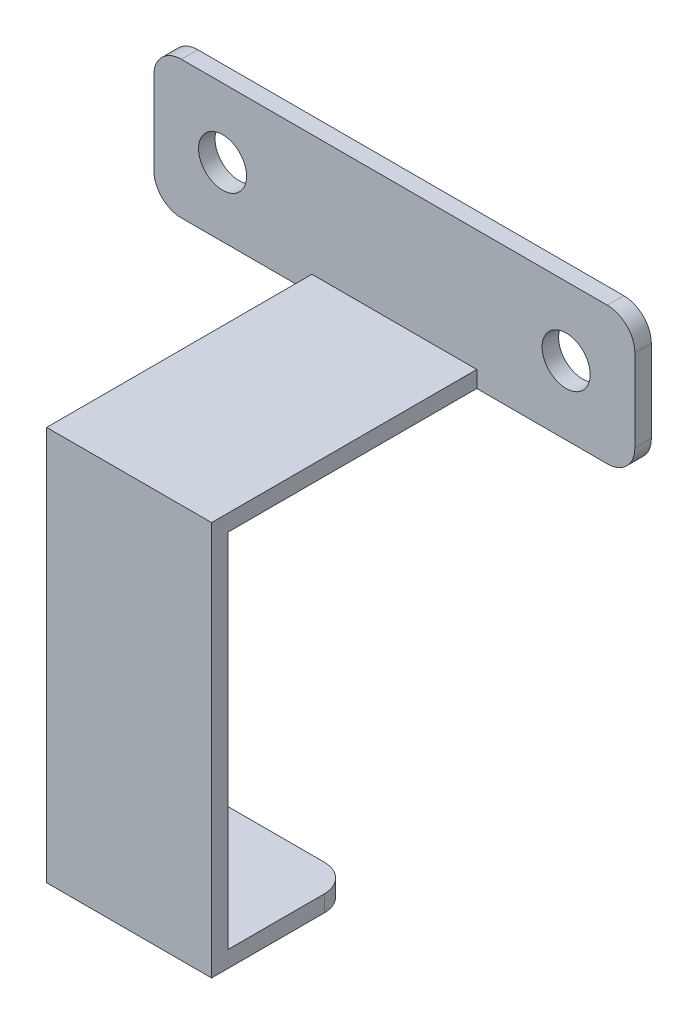
ISO-10303-21;
HEADER;
FILE_DESCRIPTION(('STEP AP214'),'2;1');
FILE_NAME('part.step','',(''),(''),'','','');
FILE_SCHEMA(('AUTOMOTIVE_DESIGN { 1 0 10303 214 1 1 1 1 }'));
ENDSEC;
DATA;
#1=APPLICATION_CONTEXT('core data for automotive mechanical design processes');
#2=APPLICATION_PROTOCOL_DEFINITION('international standard','automotive_design',2000,#1);
#3=PRODUCT_CONTEXT('',#1,'mechanical');
#4=PRODUCT('Part','Part','',(#3));
#5=PRODUCT_RELATED_PRODUCT_CATEGORY('part','',(#4));
#6=PRODUCT_DEFINITION_FORMATION('','',#4);
#7=PRODUCT_DEFINITION_CONTEXT('part definition',#1,'design');
#8=PRODUCT_DEFINITION('design','',#6,#7);
#9=PRODUCT_DEFINITION_SHAPE('','',#8);
#10=(LENGTH_UNIT() NAMED_UNIT(*) SI_UNIT(.MILLI.,.METRE.));
#11=(NAMED_UNIT(*) PLANE_ANGLE_UNIT() SI_UNIT($,.RADIAN.));
#12=(NAMED_UNIT(*) SI_UNIT($,.STERADIAN.) SOLID_ANGLE_UNIT());
#13=UNCERTAINTY_MEASURE_WITH_UNIT(LENGTH_MEASURE(1.E-05),#10,'distance_accuracy_value','');
#14=(GEOMETRIC_REPRESENTATION_CONTEXT(3) GLOBAL_UNCERTAINTY_ASSIGNED_CONTEXT((#13)) GLOBAL_UNIT_ASSIGNED_CONTEXT((#10,
#11,#12)) REPRESENTATION_CONTEXT('',''));
#15=CARTESIAN_POINT('',(0.,0.,0.));
#16=DIRECTION('',(0.,0.,1.));
#17=DIRECTION('',(1.,0.,0.));
#18=AXIS2_PLACEMENT_3D('',#15,#16,#17);
#19=CARTESIAN_POINT('',(-15.5,2.,1.2));
#20=DIRECTION('',(0.,0.,-1.));
#21=DIRECTION('',(-1.,0.,0.));
#22=AXIS2_PLACEMENT_3D('',#19,#20,#21);
#23=CYLINDRICAL_SURFACE('',#22,2.);
#24=CARTESIAN_POINT('',(-15.5,2.,0.));
#25=DIRECTION('',(0.,0.,-1.));
#26=DIRECTION('',(-1.,0.,0.));
#27=AXIS2_PLACEMENT_3D('',#24,#25,#26);
#28=CIRCLE('',#27,2.);
#29=CARTESIAN_POINT('',(-15.5,0.,0.));
#30=VERTEX_POINT('',#29);
#31=CARTESIAN_POINT('',(-17.5,2.,0.));
#32=VERTEX_POINT('',#31);
#33=EDGE_CURVE('E200',#30,#32,#28,.T.);
#34=ORIENTED_EDGE('',*,*,#33,.F.);
#35=DIRECTION('',(0.,0.,1.));
#36=VECTOR('',#35,1.);
#37=CARTESIAN_POINT('',(-15.5,0.,0.6));
#38=LINE('',#37,#36);
#39=CARTESIAN_POINT('',(-15.5,0.,1.2));
#40=VERTEX_POINT('',#39);
#41=EDGE_CURVE('E208',#30,#40,#38,.T.);
#42=ORIENTED_EDGE('',*,*,#41,.T.);
#43=CARTESIAN_POINT('',(-15.5,2.,1.2));
#44=DIRECTION('',(0.,0.,-1.));
#45=DIRECTION('',(-1.,0.,0.));
#46=AXIS2_PLACEMENT_3D('',#43,#44,#45);
#47=CIRCLE('',#46,2.);
#48=CARTESIAN_POINT('',(-17.5,2.,1.2));
#49=VERTEX_POINT('',#48);
#50=EDGE_CURVE('E257',#40,#49,#47,.T.);
#51=ORIENTED_EDGE('',*,*,#50,.T.);
#52=DIRECTION('',(0.,0.,-1.));
#53=VECTOR('',#52,1.);
#54=CARTESIAN_POINT('',(-17.5,2.,0.6));
#55=LINE('',#54,#53);
#56=EDGE_CURVE('E11',#49,#32,#55,.T.);
#57=ORIENTED_EDGE('',*,*,#56,.T.);
#58=EDGE_LOOP('',(#34,#42,#51,#57));
#59=FACE_BOUND('',#58,.T.);
#60=ADVANCED_FACE('F17',(#59),#23,.T.);
#61=CARTESIAN_POINT('',(-17.5,2.,1.2));
#62=DIRECTION('',(1.,0.,0.));
#63=DIRECTION('',(0.,1.,0.));
#64=AXIS2_PLACEMENT_3D('',#61,#62,#63);
#65=PLANE('',#64);
#66=DIRECTION('',(0.,0.,1.));
#67=VECTOR('',#66,1.);
#68=CARTESIAN_POINT('',(-17.5,8.,0.6));
#69=LINE('',#68,#67);
#70=CARTESIAN_POINT('',(-17.5,8.,0.));
#71=VERTEX_POINT('',#70);
#72=CARTESIAN_POINT('',(-17.5,8.,1.2));
#73=VERTEX_POINT('',#72);
#74=EDGE_CURVE('E26',#71,#73,#69,.T.);
#75=ORIENTED_EDGE('',*,*,#74,.F.);
#76=DIRECTION('',(0.,1.,0.));
#77=VECTOR('',#76,1.);
#78=CARTESIAN_POINT('',(-17.5,5.,0.));
#79=LINE('',#78,#77);
#80=EDGE_CURVE('E267',#32,#71,#79,.T.);
#81=ORIENTED_EDGE('',*,*,#80,.F.);
#82=ORIENTED_EDGE('',*,*,#56,.F.);
#83=DIRECTION('',(0.,1.,0.));
#84=VECTOR('',#83,1.);
#85=CARTESIAN_POINT('',(-17.5,5.,1.2));
#86=LINE('',#85,#84);
#87=EDGE_CURVE('E253',#49,#73,#86,.T.);
#88=ORIENTED_EDGE('',*,*,#87,.T.);
#89=EDGE_LOOP('',(#75,#81,#82,#88));
#90=FACE_BOUND('',#89,.T.);
#91=ADVANCED_FACE('F753',(#90),#65,.F.);
#92=CARTESIAN_POINT('',(-15.5,8.,1.2));
#93=DIRECTION('',(0.,0.,-1.));
#94=DIRECTION('',(-1.,0.,0.));
#95=AXIS2_PLACEMENT_3D('',#92,#93,#94);
#96=CYLINDRICAL_SURFACE('',#95,2.);
#97=CARTESIAN_POINT('',(-15.5,8.,0.));
#98=DIRECTION('',(0.,0.,-1.));
#99=DIRECTION('',(-1.,0.,0.));
#100=AXIS2_PLACEMENT_3D('',#97,#98,#99);
#101=CIRCLE('',#100,2.);
#102=CARTESIAN_POINT('',(-15.5,10.,0.));
#103=VERTEX_POINT('',#102);
#104=EDGE_CURVE('E270',#71,#103,#101,.T.);
#105=ORIENTED_EDGE('',*,*,#104,.F.);
#106=ORIENTED_EDGE('',*,*,#74,.T.);
#107=CARTESIAN_POINT('',(-15.5,8.,1.2));
#108=DIRECTION('',(0.,0.,-1.));
#109=DIRECTION('',(-1.,0.,0.));
#110=AXIS2_PLACEMENT_3D('',#107,#108,#109);
#111=CIRCLE('',#110,2.);
#112=CARTESIAN_POINT('',(-15.5,10.,1.2));
#113=VERTEX_POINT('',#112);
#114=EDGE_CURVE('E249',#73,#113,#111,.T.);
#115=ORIENTED_EDGE('',*,*,#114,.T.);
#116=DIRECTION('',(0.,0.,-1.));
#117=VECTOR('',#116,1.);
#118=CARTESIAN_POINT('',(-15.5,10.,0.6));
#119=LINE('',#118,#117);
#120=EDGE_CURVE('E239',#113,#103,#119,.T.);
#121=ORIENTED_EDGE('',*,*,#120,.T.);
#122=EDGE_LOOP('',(#105,#106,#115,#121));
#123=FACE_BOUND('',#122,.T.);
#124=ADVANCED_FACE('F19',(#123),#96,.T.);
#125=CARTESIAN_POINT('',(-15.5,10.,1.2));
#126=DIRECTION('',(0.,-1.,0.));
#127=DIRECTION('',(0.,0.,-1.));
#128=AXIS2_PLACEMENT_3D('',#125,#126,#127);
#129=PLANE('',#128);
#130=DIRECTION('',(0.,0.,1.));
#131=VECTOR('',#130,1.);
#132=CARTESIAN_POINT('',(15.5,10.,0.6));
#133=LINE('',#132,#131);
#134=CARTESIAN_POINT('',(15.5,10.,0.));
#135=VERTEX_POINT('',#134);
#136=CARTESIAN_POINT('',(15.5,10.,1.2));
#137=VERTEX_POINT('',#136);
#138=EDGE_CURVE('E279',#135,#137,#133,.T.);
#139=ORIENTED_EDGE('',*,*,#138,.F.);
#140=DIRECTION('',(1.,0.,0.));
#141=VECTOR('',#140,1.);
#142=CARTESIAN_POINT('',(0.,10.,0.));
#143=LINE('',#142,#141);
#144=EDGE_CURVE('E294',#103,#135,#143,.T.);
#145=ORIENTED_EDGE('',*,*,#144,.F.);
#146=ORIENTED_EDGE('',*,*,#120,.F.);
#147=DIRECTION('',(1.,0.,0.));
#148=VECTOR('',#147,1.);
#149=CARTESIAN_POINT('',(0.,10.,1.2));
#150=LINE('',#149,#148);
#151=EDGE_CURVE('E245',#113,#137,#150,.T.);
#152=ORIENTED_EDGE('',*,*,#151,.T.);
#153=EDGE_LOOP('',(#139,#145,#146,#152));
#154=FACE_BOUND('',#153,.T.);
#155=ADVANCED_FACE('F848',(#154),#129,.F.);
#156=CARTESIAN_POINT('',(15.5,8.,1.2));
#157=DIRECTION('',(0.,0.,-1.));
#158=DIRECTION('',(0.,1.,0.));
#159=AXIS2_PLACEMENT_3D('',#156,#157,#158);
#160=CYLINDRICAL_SURFACE('',#159,2.);
#161=CARTESIAN_POINT('',(15.5,8.,0.));
#162=DIRECTION('',(0.,0.,-1.));
#163=DIRECTION('',(0.,1.,0.));
#164=AXIS2_PLACEMENT_3D('',#161,#162,#163);
#165=CIRCLE('',#164,2.);
#166=CARTESIAN_POINT('',(17.5,8.,0.));
#167=VERTEX_POINT('',#166);
#168=EDGE_CURVE('E273',#135,#167,#165,.T.);
#169=ORIENTED_EDGE('',*,*,#168,.F.);
#170=ORIENTED_EDGE('',*,*,#138,.T.);
#171=CARTESIAN_POINT('',(15.5,8.,1.2));
#172=DIRECTION('',(0.,0.,-1.));
#173=DIRECTION('',(0.,1.,0.));
#174=AXIS2_PLACEMENT_3D('',#171,#172,#173);
#175=CIRCLE('',#174,2.);
#176=CARTESIAN_POINT('',(17.5,8.,1.2));
#177=VERTEX_POINT('',#176);
#178=EDGE_CURVE('E242',#137,#177,#175,.T.);
#179=ORIENTED_EDGE('',*,*,#178,.T.);
#180=DIRECTION('',(0.,0.,-1.));
#181=VECTOR('',#180,1.);
#182=CARTESIAN_POINT('',(17.5,8.,0.6));
#183=LINE('',#182,#181);
#184=EDGE_CURVE('E50',#177,#167,#183,.T.);
#185=ORIENTED_EDGE('',*,*,#184,.T.);
#186=EDGE_LOOP('',(#169,#170,#179,#185));
#187=FACE_BOUND('',#186,.T.);
#188=ADVANCED_FACE('F840',(#187),#160,.T.);
#189=CARTESIAN_POINT('',(17.5,8.,0.));
#190=DIRECTION('',(-1.,0.,0.));
#191=DIRECTION('',(0.,0.,1.));
#192=AXIS2_PLACEMENT_3D('',#189,#190,#191);
#193=PLANE('',#192);
#194=ORIENTED_EDGE('',*,*,#184,.F.);
#195=DIRECTION('',(0.,-1.,0.));
#196=VECTOR('',#195,1.);
#197=CARTESIAN_POINT('',(17.5,5.,1.2));
#198=LINE('',#197,#196);
#199=CARTESIAN_POINT('',(17.5,2.,1.2));
#200=VERTEX_POINT('',#199);
#201=EDGE_CURVE('E236',#177,#200,#198,.T.);
#202=ORIENTED_EDGE('',*,*,#201,.T.);
#203=DIRECTION('',(0.,0.,1.));
#204=VECTOR('',#203,1.);
#205=CARTESIAN_POINT('',(17.5,2.,0.6));
#206=LINE('',#205,#204);
#207=CARTESIAN_POINT('',(17.5,2.,0.));
#208=VERTEX_POINT('',#207);
#209=EDGE_CURVE('E39',#208,#200,#206,.T.);
#210=ORIENTED_EDGE('',*,*,#209,.F.);
#211=DIRECTION('',(0.,-1.,0.));
#212=VECTOR('',#211,1.);
#213=CARTESIAN_POINT('',(17.5,5.,0.));
#214=LINE('',#213,#212);
#215=EDGE_CURVE('E196',#167,#208,#214,.T.);
#216=ORIENTED_EDGE('',*,*,#215,.F.);
#217=EDGE_LOOP('',(#194,#202,#210,#216));
#218=FACE_BOUND('',#217,.T.);
#219=ADVANCED_FACE('F739',(#218),#193,.F.);
#220=CARTESIAN_POINT('',(15.5,2.,1.2));
#221=DIRECTION('',(0.,0.,-1.));
#222=DIRECTION('',(0.,1.,0.));
#223=AXIS2_PLACEMENT_3D('',#220,#221,#222);
#224=CYLINDRICAL_SURFACE('',#223,2.);
#225=CARTESIAN_POINT('',(15.5,2.,0.));
#226=DIRECTION('',(0.,0.,-1.));
#227=DIRECTION('',(0.,1.,0.));
#228=AXIS2_PLACEMENT_3D('',#225,#226,#227);
#229=CIRCLE('',#228,2.);
#230=CARTESIAN_POINT('',(15.5,0.,0.));
#231=VERTEX_POINT('',#230);
#232=EDGE_CURVE('E188',#208,#231,#229,.T.);
#233=ORIENTED_EDGE('',*,*,#232,.F.);
#234=ORIENTED_EDGE('',*,*,#209,.T.);
#235=CARTESIAN_POINT('',(15.5,2.,1.2));
#236=DIRECTION('',(0.,0.,-1.));
#237=DIRECTION('',(0.,1.,0.));
#238=AXIS2_PLACEMENT_3D('',#235,#236,#237);
#239=CIRCLE('',#238,2.);
#240=CARTESIAN_POINT('',(15.5,0.,1.2));
#241=VERTEX_POINT('',#240);
#242=EDGE_CURVE('E210',#200,#241,#239,.T.);
#243=ORIENTED_EDGE('',*,*,#242,.T.);
#244=DIRECTION('',(0.,0.,-1.));
#245=VECTOR('',#244,1.);
#246=CARTESIAN_POINT('',(15.5,0.,0.6));
#247=LINE('',#246,#245);
#248=EDGE_CURVE('E205',#241,#231,#247,.T.);
#249=ORIENTED_EDGE('',*,*,#248,.T.);
#250=EDGE_LOOP('',(#233,#234,#243,#249));
#251=FACE_BOUND('',#250,.T.);
#252=ADVANCED_FACE('F212',(#251),#224,.T.);
#253=CARTESIAN_POINT('',(17.5,0.,0.));
#254=DIRECTION('',(0.,0.,-1.));
#255=DIRECTION('',(0.,-1.,0.));
#256=AXIS2_PLACEMENT_3D('',#253,#254,#255);
#257=PLANE('',#256);
#258=CARTESIAN_POINT('',(12.5,5.,0.));
#259=DIRECTION('',(0.,0.,1.));
#260=DIRECTION('',(1.,0.,0.));
#261=AXIS2_PLACEMENT_3D('',#258,#259,#260);
#262=CIRCLE('',#261,1.75);
#263=CARTESIAN_POINT('',(14.25,5.,0.));
#264=VERTEX_POINT('',#263);
#265=EDGE_CURVE('E443',#264,#264,#262,.T.);
#266=ORIENTED_EDGE('',*,*,#265,.T.);
#267=EDGE_LOOP('',(#266));
#268=FACE_BOUND('',#267,.T.);
#269=CARTESIAN_POINT('',(-12.5,5.,0.));
#270=DIRECTION('',(0.,0.,1.));
#271=DIRECTION('',(1.,0.,0.));
#272=AXIS2_PLACEMENT_3D('',#269,#270,#271);
#273=CIRCLE('',#272,1.75);
#274=CARTESIAN_POINT('',(-10.75,5.,0.));
#275=VERTEX_POINT('',#274);
#276=EDGE_CURVE('E440',#275,#275,#273,.T.);
#277=ORIENTED_EDGE('',*,*,#276,.T.);
#278=EDGE_LOOP('',(#277));
#279=FACE_BOUND('',#278,.T.);
#280=ORIENTED_EDGE('',*,*,#80,.T.);
#281=ORIENTED_EDGE('',*,*,#104,.T.);
#282=ORIENTED_EDGE('',*,*,#144,.T.);
#283=ORIENTED_EDGE('',*,*,#168,.T.);
#284=ORIENTED_EDGE('',*,*,#215,.T.);
#285=ORIENTED_EDGE('',*,*,#232,.T.);
#286=DIRECTION('',(-1.,0.,0.));
#287=VECTOR('',#286,1.);
#288=CARTESIAN_POINT('',(0.,0.,0.));
#289=LINE('',#288,#287);
#290=EDGE_CURVE('E193',#231,#30,#289,.T.);
#291=ORIENTED_EDGE('',*,*,#290,.T.);
#292=ORIENTED_EDGE('',*,*,#33,.T.);
#293=EDGE_LOOP('',(#280,#281,#282,#283,#284,#285,#291,#292));
#294=FACE_BOUND('',#293,.T.);
#295=ADVANCED_FACE('F191',(#268,#279,#294),#257,.T.);
#296=CARTESIAN_POINT('',(-4.,-27.5,12.3));
#297=DIRECTION('',(0.,1.,0.));
#298=DIRECTION('',(0.,0.,1.));
#299=AXIS2_PLACEMENT_3D('',#296,#297,#298);
#300=CYLINDRICAL_SURFACE('',#299,2.);
#301=CARTESIAN_POINT('',(-4.,-26.3,12.3));
#302=DIRECTION('',(0.,-1.,0.));
#303=DIRECTION('',(0.,0.,1.));
#304=AXIS2_PLACEMENT_3D('',#301,#302,#303);
#305=CIRCLE('',#304,2.);
#306=CARTESIAN_POINT('',(-6.,-26.3,12.3));
#307=VERTEX_POINT('',#306);
#308=CARTESIAN_POINT('',(-4.,-26.3,10.3));
#309=VERTEX_POINT('',#308);
#310=EDGE_CURVE('E360',#307,#309,#305,.T.);
#311=ORIENTED_EDGE('',*,*,#310,.T.);
#312=DIRECTION('',(0.,-1.,0.));
#313=VECTOR('',#312,1.);
#314=CARTESIAN_POINT('',(-4.,-26.9,10.3));
#315=LINE('',#314,#313);
#316=CARTESIAN_POINT('',(-4.,-27.5,10.3));
#317=VERTEX_POINT('',#316);
#318=EDGE_CURVE('E264',#309,#317,#315,.T.);
#319=ORIENTED_EDGE('',*,*,#318,.T.);
#320=CARTESIAN_POINT('',(-4.,-27.5,12.3));
#321=DIRECTION('',(0.,-1.,0.));
#322=DIRECTION('',(0.,0.,1.));
#323=AXIS2_PLACEMENT_3D('',#320,#321,#322);
#324=CIRCLE('',#323,2.);
#325=CARTESIAN_POINT('',(-6.,-27.5,12.3));
#326=VERTEX_POINT('',#325);
#327=EDGE_CURVE('E323',#326,#317,#324,.T.);
#328=ORIENTED_EDGE('',*,*,#327,.F.);
#329=DIRECTION('',(0.,1.,0.));
#330=VECTOR('',#329,1.);
#331=CARTESIAN_POINT('',(-6.,-26.9,12.3));
#332=LINE('',#331,#330);
#333=EDGE_CURVE('E335',#326,#307,#332,.T.);
#334=ORIENTED_EDGE('',*,*,#333,.T.);
#335=EDGE_LOOP('',(#311,#319,#328,#334));
#336=FACE_BOUND('',#335,.T.);
#337=ADVANCED_FACE('F817',(#336),#300,.T.);
#338=CARTESIAN_POINT('',(-4.,-27.5,10.3));
#339=DIRECTION('',(0.,0.,1.));
#340=DIRECTION('',(1.,0.,0.));
#341=AXIS2_PLACEMENT_3D('',#338,#339,#340);
#342=PLANE('',#341);
#343=ORIENTED_EDGE('',*,*,#318,.F.);
#344=DIRECTION('',(1.,0.,0.));
#345=VECTOR('',#344,1.);
#346=CARTESIAN_POINT('',(0.,-26.3,10.3));
#347=LINE('',#346,#345);
#348=CARTESIAN_POINT('',(4.,-26.3,10.3));
#349=VERTEX_POINT('',#348);
#350=EDGE_CURVE('E226',#309,#349,#347,.T.);
#351=ORIENTED_EDGE('',*,*,#350,.T.);
#352=DIRECTION('',(0.,1.,0.));
#353=VECTOR('',#352,1.);
#354=CARTESIAN_POINT('',(4.,-26.9,10.3));
#355=LINE('',#354,#353);
#356=CARTESIAN_POINT('',(4.,-27.5,10.3));
#357=VERTEX_POINT('',#356);
#358=EDGE_CURVE('E260',#357,#349,#355,.T.);
#359=ORIENTED_EDGE('',*,*,#358,.F.);
#360=DIRECTION('',(1.,0.,0.));
#361=VECTOR('',#360,1.);
#362=CARTESIAN_POINT('',(0.,-27.5,10.3));
#363=LINE('',#362,#361);
#364=EDGE_CURVE('E324',#317,#357,#363,.T.);
#365=ORIENTED_EDGE('',*,*,#364,.F.);
#366=EDGE_LOOP('',(#343,#351,#359,#365));
#367=FACE_BOUND('',#366,.T.);
#368=ADVANCED_FACE('F304',(#367),#342,.F.);
#369=CARTESIAN_POINT('',(4.,-26.3,12.3));
#370=DIRECTION('',(0.,-1.,0.));
#371=DIRECTION('',(0.,0.,-1.));
#372=AXIS2_PLACEMENT_3D('',#369,#370,#371);
#373=CYLINDRICAL_SURFACE('',#372,2.);
#374=CARTESIAN_POINT('',(4.,-27.5,12.3));
#375=DIRECTION('',(0.,-1.,0.));
#376=DIRECTION('',(0.,0.,-1.));
#377=AXIS2_PLACEMENT_3D('',#374,#375,#376);
#378=CIRCLE('',#377,2.);
#379=CARTESIAN_POINT('',(6.,-27.5,12.3));
#380=VERTEX_POINT('',#379);
#381=EDGE_CURVE('E319',#357,#380,#378,.T.);
#382=ORIENTED_EDGE('',*,*,#381,.F.);
#383=ORIENTED_EDGE('',*,*,#358,.T.);
#384=CARTESIAN_POINT('',(4.,-26.3,12.3));
#385=DIRECTION('',(0.,-1.,0.));
#386=DIRECTION('',(0.,0.,-1.));
#387=AXIS2_PLACEMENT_3D('',#384,#385,#386);
#388=CIRCLE('',#387,2.);
#389=CARTESIAN_POINT('',(6.,-26.3,12.3));
#390=VERTEX_POINT('',#389);
#391=EDGE_CURVE('E291',#349,#390,#388,.T.);
#392=ORIENTED_EDGE('',*,*,#391,.T.);
#393=DIRECTION('',(0.,-1.,0.));
#394=VECTOR('',#393,1.);
#395=CARTESIAN_POINT('',(6.,-26.9,12.3));
#396=LINE('',#395,#394);
#397=EDGE_CURVE('E317',#390,#380,#396,.T.);
#398=ORIENTED_EDGE('',*,*,#397,.T.);
#399=EDGE_LOOP('',(#382,#383,#392,#398));
#400=FACE_BOUND('',#399,.T.);
#401=ADVANCED_FACE('F316',(#400),#373,.T.);
#402=CARTESIAN_POINT('',(17.5,0.,1.2));
#403=DIRECTION('',(0.,0.,-1.));
#404=DIRECTION('',(0.,-1.,0.));
#405=AXIS2_PLACEMENT_3D('',#402,#403,#404);
#406=PLANE('',#405);
#407=CARTESIAN_POINT('',(12.5,5.,1.2));
#408=DIRECTION('',(0.,0.,1.));
#409=DIRECTION('',(1.,0.,0.));
#410=AXIS2_PLACEMENT_3D('',#407,#408,#409);
#411=CIRCLE('',#410,1.75);
#412=CARTESIAN_POINT('',(14.25,5.,1.2));
#413=VERTEX_POINT('',#412);
#414=EDGE_CURVE('E447',#413,#413,#411,.T.);
#415=ORIENTED_EDGE('',*,*,#414,.F.);
#416=EDGE_LOOP('',(#415));
#417=FACE_BOUND('',#416,.T.);
#418=CARTESIAN_POINT('',(-12.5,5.,1.2));
#419=DIRECTION('',(0.,0.,1.));
#420=DIRECTION('',(1.,0.,0.));
#421=AXIS2_PLACEMENT_3D('',#418,#419,#420);
#422=CIRCLE('',#421,1.75);
#423=CARTESIAN_POINT('',(-10.75,5.,1.2));
#424=VERTEX_POINT('',#423);
#425=EDGE_CURVE('E448',#424,#424,#422,.T.);
#426=ORIENTED_EDGE('',*,*,#425,.F.);
#427=EDGE_LOOP('',(#426));
#428=FACE_BOUND('',#427,.T.);
#429=DIRECTION('',(0.,1.,0.));
#430=VECTOR('',#429,1.);
#431=CARTESIAN_POINT('',(-6.,-13.15,1.2));
#432=LINE('',#431,#430);
#433=CARTESIAN_POINT('',(-6.,0.,1.2));
#434=VERTEX_POINT('',#433);
#435=CARTESIAN_POINT('',(-6.,1.2,1.2));
#436=VERTEX_POINT('',#435);
#437=EDGE_CURVE('E341',#434,#436,#432,.T.);
#438=ORIENTED_EDGE('',*,*,#437,.T.);
#439=DIRECTION('',(1.,0.,0.));
#440=VECTOR('',#439,1.);
#441=CARTESIAN_POINT('',(0.,1.2,1.2));
#442=LINE('',#441,#440);
#443=CARTESIAN_POINT('',(6.,1.2,1.2));
#444=VERTEX_POINT('',#443);
#445=EDGE_CURVE('E415',#436,#444,#442,.T.);
#446=ORIENTED_EDGE('',*,*,#445,.T.);
#447=DIRECTION('',(0.,1.,0.));
#448=VECTOR('',#447,1.);
#449=CARTESIAN_POINT('',(6.,5.,1.2));
#450=LINE('',#449,#448);
#451=CARTESIAN_POINT('',(6.,0.,1.2));
#452=VERTEX_POINT('',#451);
#453=EDGE_CURVE('E389',#452,#444,#450,.T.);
#454=ORIENTED_EDGE('',*,*,#453,.F.);
#455=DIRECTION('',(1.,0.,0.));
#456=VECTOR('',#455,1.);
#457=CARTESIAN_POINT('',(0.,0.,1.2));
#458=LINE('',#457,#456);
#459=EDGE_CURVE('E216',#452,#241,#458,.T.);
#460=ORIENTED_EDGE('',*,*,#459,.T.);
#461=ORIENTED_EDGE('',*,*,#242,.F.);
#462=ORIENTED_EDGE('',*,*,#201,.F.);
#463=ORIENTED_EDGE('',*,*,#178,.F.);
#464=ORIENTED_EDGE('',*,*,#151,.F.);
#465=ORIENTED_EDGE('',*,*,#114,.F.);
#466=ORIENTED_EDGE('',*,*,#87,.F.);
#467=ORIENTED_EDGE('',*,*,#50,.F.);
#468=DIRECTION('',(1.,0.,0.));
#469=VECTOR('',#468,1.);
#470=CARTESIAN_POINT('',(0.,0.,1.2));
#471=LINE('',#470,#469);
#472=EDGE_CURVE('E224',#40,#434,#471,.T.);
#473=ORIENTED_EDGE('',*,*,#472,.T.);
#474=EDGE_LOOP('',(#438,#446,#454,#460,#461,#462,#463,#464,#465,#466,#467,#473));
#475=FACE_BOUND('',#474,.T.);
#476=ADVANCED_FACE('F773',(#417,#428,#475),#406,.F.);
#477=CARTESIAN_POINT('',(15.5,0.,0.));
#478=DIRECTION('',(0.,1.,0.));
#479=DIRECTION('',(1.,0.,0.));
#480=AXIS2_PLACEMENT_3D('',#477,#478,#479);
#481=PLANE('',#480);
#482=ORIENTED_EDGE('',*,*,#248,.F.);
#483=ORIENTED_EDGE('',*,*,#459,.F.);
#484=DIRECTION('',(0.,0.,1.));
#485=VECTOR('',#484,1.);
#486=CARTESIAN_POINT('',(6.,0.,10.85));
#487=LINE('',#486,#485);
#488=CARTESIAN_POINT('',(6.,0.,19.3));
#489=VERTEX_POINT('',#488);
#490=EDGE_CURVE('E384',#452,#489,#487,.T.);
#491=ORIENTED_EDGE('',*,*,#490,.T.);
#492=DIRECTION('',(-1.,0.,0.));
#493=VECTOR('',#492,1.);
#494=CARTESIAN_POINT('',(0.,0.,19.3));
#495=LINE('',#494,#493);
#496=CARTESIAN_POINT('',(-6.,0.,19.3));
#497=VERTEX_POINT('',#496);
#498=EDGE_CURVE('E217',#489,#497,#495,.T.);
#499=ORIENTED_EDGE('',*,*,#498,.T.);
#500=DIRECTION('',(0.,0.,-1.));
#501=VECTOR('',#500,1.);
#502=CARTESIAN_POINT('',(-6.,0.,10.85));
#503=LINE('',#502,#501);
#504=EDGE_CURVE('E344',#497,#434,#503,.T.);
#505=ORIENTED_EDGE('',*,*,#504,.T.);
#506=ORIENTED_EDGE('',*,*,#472,.F.);
#507=ORIENTED_EDGE('',*,*,#41,.F.);
#508=ORIENTED_EDGE('',*,*,#290,.F.);
#509=EDGE_LOOP('',(#482,#483,#491,#499,#505,#506,#507,#508));
#510=FACE_BOUND('',#509,.T.);
#511=ADVANCED_FACE('F204',(#510),#481,.F.);
#512=CARTESIAN_POINT('',(-6.,-26.3,19.3));
#513=DIRECTION('',(0.,0.,1.));
#514=DIRECTION('',(1.,0.,0.));
#515=AXIS2_PLACEMENT_3D('',#512,#513,#514);
#516=PLANE('',#515);
#517=DIRECTION('',(0.,-1.,0.));
#518=VECTOR('',#517,1.);
#519=CARTESIAN_POINT('',(6.,-13.15,19.3));
#520=LINE('',#519,#518);
#521=CARTESIAN_POINT('',(6.,-26.3,19.3));
#522=VERTEX_POINT('',#521);
#523=EDGE_CURVE('E374',#489,#522,#520,.T.);
#524=ORIENTED_EDGE('',*,*,#523,.T.);
#525=DIRECTION('',(-1.,0.,0.));
#526=VECTOR('',#525,1.);
#527=CARTESIAN_POINT('',(0.,-26.3,19.3));
#528=LINE('',#527,#526);
#529=CARTESIAN_POINT('',(-6.,-26.3,19.3));
#530=VERTEX_POINT('',#529);
#531=EDGE_CURVE('E289',#522,#530,#528,.T.);
#532=ORIENTED_EDGE('',*,*,#531,.T.);
#533=DIRECTION('',(0.,1.,0.));
#534=VECTOR('',#533,1.);
#535=CARTESIAN_POINT('',(-6.,-13.15,19.3));
#536=LINE('',#535,#534);
#537=EDGE_CURVE('E348',#530,#497,#536,.T.);
#538=ORIENTED_EDGE('',*,*,#537,.T.);
#539=ORIENTED_EDGE('',*,*,#498,.F.);
#540=EDGE_LOOP('',(#524,#532,#538,#539));
#541=FACE_BOUND('',#540,.T.);
#542=ADVANCED_FACE('F370',(#541),#516,.F.);
#543=CARTESIAN_POINT('',(-6.,-26.3,19.3));
#544=DIRECTION('',(0.,-1.,0.));
#545=DIRECTION('',(0.,0.,-1.));
#546=AXIS2_PLACEMENT_3D('',#543,#544,#545);
#547=PLANE('',#546);
#548=ORIENTED_EDGE('',*,*,#310,.F.);
#549=DIRECTION('',(0.,0.,1.));
#550=VECTOR('',#549,1.);
#551=CARTESIAN_POINT('',(-6.,-26.3,10.85));
#552=LINE('',#551,#550);
#553=EDGE_CURVE('E352',#307,#530,#552,.T.);
#554=ORIENTED_EDGE('',*,*,#553,.T.);
#555=ORIENTED_EDGE('',*,*,#531,.F.);
#556=DIRECTION('',(0.,0.,-1.));
#557=VECTOR('',#556,1.);
#558=CARTESIAN_POINT('',(6.,-26.3,10.85));
#559=LINE('',#558,#557);
#560=EDGE_CURVE('E312',#522,#390,#559,.T.);
#561=ORIENTED_EDGE('',*,*,#560,.T.);
#562=ORIENTED_EDGE('',*,*,#391,.F.);
#563=ORIENTED_EDGE('',*,*,#350,.F.);
#564=EDGE_LOOP('',(#548,#554,#555,#561,#562,#563));
#565=FACE_BOUND('',#564,.T.);
#566=ADVANCED_FACE('F310',(#565),#547,.F.);
#567=CARTESIAN_POINT('',(-6.,-27.5,10.3));
#568=DIRECTION('',(0.,-1.,0.));
#569=DIRECTION('',(0.,0.,-1.));
#570=AXIS2_PLACEMENT_3D('',#567,#568,#569);
#571=PLANE('',#570);
#572=ORIENTED_EDGE('',*,*,#364,.T.);
#573=ORIENTED_EDGE('',*,*,#381,.T.);
#574=DIRECTION('',(0.,0.,1.));
#575=VECTOR('',#574,1.);
#576=CARTESIAN_POINT('',(6.,-27.5,10.85));
#577=LINE('',#576,#575);
#578=CARTESIAN_POINT('',(6.,-27.5,20.5));
#579=VERTEX_POINT('',#578);
#580=EDGE_CURVE('E405',#380,#579,#577,.T.);
#581=ORIENTED_EDGE('',*,*,#580,.T.);
#582=DIRECTION('',(-1.,0.,0.));
#583=VECTOR('',#582,1.);
#584=CARTESIAN_POINT('',(0.,-27.5,20.5));
#585=LINE('',#584,#583);
#586=CARTESIAN_POINT('',(-6.,-27.5,20.5));
#587=VERTEX_POINT('',#586);
#588=EDGE_CURVE('E399',#579,#587,#585,.T.);
#589=ORIENTED_EDGE('',*,*,#588,.T.);
#590=DIRECTION('',(0.,0.,-1.));
#591=VECTOR('',#590,1.);
#592=CARTESIAN_POINT('',(-6.,-27.5,10.85));
#593=LINE('',#592,#591);
#594=EDGE_CURVE('E330',#587,#326,#593,.T.);
#595=ORIENTED_EDGE('',*,*,#594,.T.);
#596=ORIENTED_EDGE('',*,*,#327,.T.);
#597=EDGE_LOOP('',(#572,#573,#581,#589,#595,#596));
#598=FACE_BOUND('',#597,.T.);
#599=ADVANCED_FACE('F327',(#598),#571,.T.);
#600=CARTESIAN_POINT('',(-6.,-27.5,20.5));
#601=DIRECTION('',(1.,0.,0.));
#602=DIRECTION('',(0.,1.,0.));
#603=AXIS2_PLACEMENT_3D('',#600,#601,#602);
#604=PLANE('',#603);
#605=DIRECTION('',(0.,1.,0.));
#606=VECTOR('',#605,1.);
#607=CARTESIAN_POINT('',(-6.,-13.15,20.5));
#608=LINE('',#607,#606);
#609=CARTESIAN_POINT('',(-6.,1.2,20.5));
#610=VERTEX_POINT('',#609);
#611=EDGE_CURVE('E426',#587,#610,#608,.T.);
#612=ORIENTED_EDGE('',*,*,#611,.T.);
#613=DIRECTION('',(0.,0.,-1.));
#614=VECTOR('',#613,1.);
#615=CARTESIAN_POINT('',(-6.,1.2,10.85));
#616=LINE('',#615,#614);
#617=EDGE_CURVE('E339',#610,#436,#616,.T.);
#618=ORIENTED_EDGE('',*,*,#617,.T.);
#619=ORIENTED_EDGE('',*,*,#437,.F.);
#620=ORIENTED_EDGE('',*,*,#504,.F.);
#621=ORIENTED_EDGE('',*,*,#537,.F.);
#622=ORIENTED_EDGE('',*,*,#553,.F.);
#623=ORIENTED_EDGE('',*,*,#333,.F.);
#624=ORIENTED_EDGE('',*,*,#594,.F.);
#625=EDGE_LOOP('',(#612,#618,#619,#620,#621,#622,#623,#624));
#626=FACE_BOUND('',#625,.T.);
#627=ADVANCED_FACE('F379',(#626),#604,.F.);
#628=CARTESIAN_POINT('',(-6.,1.2,20.5));
#629=DIRECTION('',(0.,-1.,0.));
#630=DIRECTION('',(0.,0.,-1.));
#631=AXIS2_PLACEMENT_3D('',#628,#629,#630);
#632=PLANE('',#631);
#633=DIRECTION('',(0.,0.,-1.));
#634=VECTOR('',#633,1.);
#635=CARTESIAN_POINT('',(6.,1.2,10.85));
#636=LINE('',#635,#634);
#637=CARTESIAN_POINT('',(6.,1.2,20.5));
#638=VERTEX_POINT('',#637);
#639=EDGE_CURVE('E408',#638,#444,#636,.T.);
#640=ORIENTED_EDGE('',*,*,#639,.T.);
#641=ORIENTED_EDGE('',*,*,#445,.F.);
#642=ORIENTED_EDGE('',*,*,#617,.F.);
#643=DIRECTION('',(1.,0.,0.));
#644=VECTOR('',#643,1.);
#645=CARTESIAN_POINT('',(0.,1.2,20.5));
#646=LINE('',#645,#644);
#647=EDGE_CURVE('E431',#610,#638,#646,.T.);
#648=ORIENTED_EDGE('',*,*,#647,.T.);
#649=EDGE_LOOP('',(#640,#641,#642,#648));
#650=FACE_BOUND('',#649,.T.);
#651=ADVANCED_FACE('F430',(#650),#632,.F.);
#652=CARTESIAN_POINT('',(6.,-27.5,1.2));
#653=DIRECTION('',(-1.,0.,0.));
#654=DIRECTION('',(0.,0.,1.));
#655=AXIS2_PLACEMENT_3D('',#652,#653,#654);
#656=PLANE('',#655);
#657=ORIENTED_EDGE('',*,*,#523,.F.);
#658=ORIENTED_EDGE('',*,*,#490,.F.);
#659=ORIENTED_EDGE('',*,*,#453,.T.);
#660=ORIENTED_EDGE('',*,*,#639,.F.);
#661=DIRECTION('',(0.,-1.,0.));
#662=VECTOR('',#661,1.);
#663=CARTESIAN_POINT('',(6.,-13.15,20.5));
#664=LINE('',#663,#662);
#665=EDGE_CURVE('E393',#638,#579,#664,.T.);
#666=ORIENTED_EDGE('',*,*,#665,.T.);
#667=ORIENTED_EDGE('',*,*,#580,.F.);
#668=ORIENTED_EDGE('',*,*,#397,.F.);
#669=ORIENTED_EDGE('',*,*,#560,.F.);
#670=EDGE_LOOP('',(#657,#658,#659,#660,#666,#667,#668,#669));
#671=FACE_BOUND('',#670,.T.);
#672=ADVANCED_FACE('F391',(#671),#656,.F.);
#673=CARTESIAN_POINT('',(6.,-27.5,20.5));
#674=DIRECTION('',(0.,0.,-1.));
#675=DIRECTION('',(0.,-1.,0.));
#676=AXIS2_PLACEMENT_3D('',#673,#674,#675);
#677=PLANE('',#676);
#678=ORIENTED_EDGE('',*,*,#647,.F.);
#679=ORIENTED_EDGE('',*,*,#611,.F.);
#680=ORIENTED_EDGE('',*,*,#588,.F.);
#681=ORIENTED_EDGE('',*,*,#665,.F.);
#682=EDGE_LOOP('',(#678,#679,#680,#681));
#683=FACE_BOUND('',#682,.T.);
#684=ADVANCED_FACE('F747',(#683),#677,.F.);
#685=CARTESIAN_POINT('',(12.5,5.,0.));
#686=DIRECTION('',(0.,0.,1.));
#687=DIRECTION('',(1.,0.,0.));
#688=AXIS2_PLACEMENT_3D('',#685,#686,#687);
#689=CYLINDRICAL_SURFACE('',#688,1.75);
#690=ORIENTED_EDGE('',*,*,#414,.T.);
#691=EDGE_LOOP('',(#690));
#692=FACE_BOUND('',#691,.T.);
#693=ORIENTED_EDGE('',*,*,#265,.F.);
#694=EDGE_LOOP('',(#693));
#695=FACE_BOUND('',#694,.T.);
#696=ADVANCED_FACE('F723',(#692,#695),#689,.F.);
#697=CARTESIAN_POINT('',(-12.5,5.,0.));
#698=DIRECTION('',(0.,0.,1.));
#699=DIRECTION('',(1.,0.,0.));
#700=AXIS2_PLACEMENT_3D('',#697,#698,#699);
#701=CYLINDRICAL_SURFACE('',#700,1.75);
#702=ORIENTED_EDGE('',*,*,#425,.T.);
#703=EDGE_LOOP('',(#702));
#704=FACE_BOUND('',#703,.T.);
#705=ORIENTED_EDGE('',*,*,#276,.F.);
#706=EDGE_LOOP('',(#705));
#707=FACE_BOUND('',#706,.T.);
#708=ADVANCED_FACE('F719',(#704,#707),#701,.F.);
#709=CLOSED_SHELL('',(#60,#91,#124,#155,#188,#219,#252,#295,#337,#368,#401,#476,#511,#542,#566,
#599,#627,#651,#672,#684,#696,#708));
#710=MANIFOLD_SOLID_BREP('B1',#709);
#711=ADVANCED_BREP_SHAPE_REPRESENTATION('',(#18,#710),#14);
#712=SHAPE_DEFINITION_REPRESENTATION(#9,#711);
ENDSEC;
END-ISO-10303-21;
